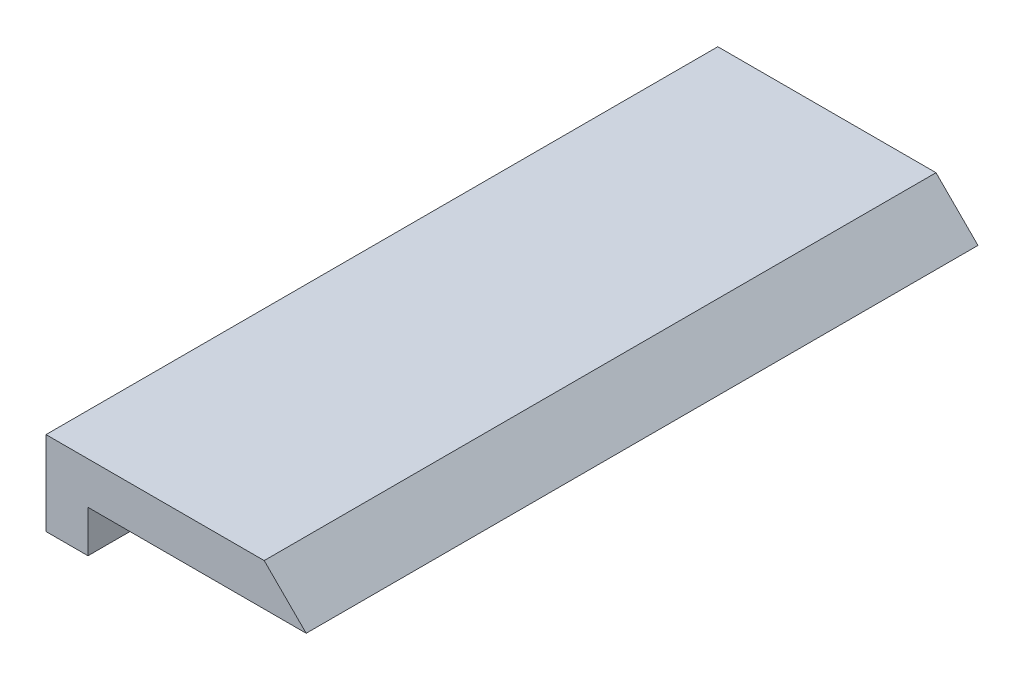
ISO-10303-21;
HEADER;
FILE_DESCRIPTION(('STEP AP214'),'2;1');
FILE_NAME('part.step','',(''),(''),'','','');
FILE_SCHEMA(('AUTOMOTIVE_DESIGN { 1 0 10303 214 1 1 1 1 }'));
ENDSEC;
DATA;
#1=APPLICATION_CONTEXT('core data for automotive mechanical design processes');
#2=APPLICATION_PROTOCOL_DEFINITION('international standard','automotive_design',2000,#1);
#3=PRODUCT_CONTEXT('',#1,'mechanical');
#4=PRODUCT('Part','Part','',(#3));
#5=PRODUCT_RELATED_PRODUCT_CATEGORY('part','',(#4));
#6=PRODUCT_DEFINITION_FORMATION('','',#4);
#7=PRODUCT_DEFINITION_CONTEXT('part definition',#1,'design');
#8=PRODUCT_DEFINITION('design','',#6,#7);
#9=PRODUCT_DEFINITION_SHAPE('','',#8);
#10=(LENGTH_UNIT() NAMED_UNIT(*) SI_UNIT(.MILLI.,.METRE.));
#11=(NAMED_UNIT(*) PLANE_ANGLE_UNIT() SI_UNIT($,.RADIAN.));
#12=(NAMED_UNIT(*) SI_UNIT($,.STERADIAN.) SOLID_ANGLE_UNIT());
#13=UNCERTAINTY_MEASURE_WITH_UNIT(LENGTH_MEASURE(1.E-05),#10,'distance_accuracy_value','');
#14=(GEOMETRIC_REPRESENTATION_CONTEXT(3) GLOBAL_UNCERTAINTY_ASSIGNED_CONTEXT((#13)) GLOBAL_UNIT_ASSIGNED_CONTEXT((#10,
#11,#12)) REPRESENTATION_CONTEXT('',''));
#15=CARTESIAN_POINT('',(0.,0.,0.));
#16=DIRECTION('',(0.,0.,1.));
#17=DIRECTION('',(1.,0.,0.));
#18=AXIS2_PLACEMENT_3D('',#15,#16,#17);
#19=CARTESIAN_POINT('',(33.,0.,50.8));
#20=DIRECTION('',(0.,1.,0.));
#21=DIRECTION('',(0.,0.,1.));
#22=AXIS2_PLACEMENT_3D('',#19,#20,#21);
#23=PLANE('',#22);
#24=DIRECTION('',(1.,0.,0.));
#25=VECTOR('',#24,1.);
#26=CARTESIAN_POINT('',(33.,0.,-50.8));
#27=LINE('',#26,#25);
#28=CARTESIAN_POINT('',(0.,0.,-50.8));
#29=VERTEX_POINT('',#28);
#30=CARTESIAN_POINT('',(33.,0.,-50.8));
#31=VERTEX_POINT('',#30);
#32=EDGE_CURVE('E121',#29,#31,#27,.T.);
#33=ORIENTED_EDGE('',*,*,#32,.T.);
#34=DIRECTION('',(0.,0.,-1.));
#35=VECTOR('',#34,1.);
#36=CARTESIAN_POINT('',(33.,0.,50.8));
#37=LINE('',#36,#35);
#38=CARTESIAN_POINT('',(33.,0.,50.8));
#39=VERTEX_POINT('',#38);
#40=EDGE_CURVE('E11',#39,#31,#37,.T.);
#41=ORIENTED_EDGE('',*,*,#40,.F.);
#42=DIRECTION('',(1.,0.,0.));
#43=VECTOR('',#42,1.);
#44=CARTESIAN_POINT('',(33.,0.,50.8));
#45=LINE('',#44,#43);
#46=CARTESIAN_POINT('',(0.,0.,50.8));
#47=VERTEX_POINT('',#46);
#48=EDGE_CURVE('E131',#47,#39,#45,.T.);
#49=ORIENTED_EDGE('',*,*,#48,.F.);
#50=DIRECTION('',(0.,0.,-1.));
#51=VECTOR('',#50,1.);
#52=CARTESIAN_POINT('',(0.,0.,50.8));
#53=LINE('',#52,#51);
#54=EDGE_CURVE('E117',#47,#29,#53,.T.);
#55=ORIENTED_EDGE('',*,*,#54,.T.);
#56=EDGE_LOOP('',(#33,#41,#49,#55));
#57=FACE_BOUND('',#56,.T.);
#58=ADVANCED_FACE('F37',(#57),#23,.F.);
#59=CARTESIAN_POINT('',(33.,0.,50.8));
#60=DIRECTION('',(-0.707106781186549,-0.707106781186546,0.));
#61=DIRECTION('',(0.707106781186546,-0.707106781186549,0.));
#62=AXIS2_PLACEMENT_3D('',#59,#60,#61);
#63=PLANE('',#62);
#64=DIRECTION('',(-0.707106781186546,0.707106781186549,0.));
#65=VECTOR('',#64,1.);
#66=CARTESIAN_POINT('',(33.,0.,-50.8));
#67=LINE('',#66,#65);
#68=CARTESIAN_POINT('',(26.65,6.35,-50.8));
#69=VERTEX_POINT('',#68);
#70=EDGE_CURVE('E124',#31,#69,#67,.T.);
#71=ORIENTED_EDGE('',*,*,#70,.T.);
#72=DIRECTION('',(0.,0.,-1.));
#73=VECTOR('',#72,1.);
#74=CARTESIAN_POINT('',(26.65,6.35,50.8));
#75=LINE('',#74,#73);
#76=CARTESIAN_POINT('',(26.65,6.35,50.8));
#77=VERTEX_POINT('',#76);
#78=EDGE_CURVE('E45',#77,#69,#75,.T.);
#79=ORIENTED_EDGE('',*,*,#78,.F.);
#80=DIRECTION('',(-0.707106781186546,0.707106781186549,0.));
#81=VECTOR('',#80,1.);
#82=CARTESIAN_POINT('',(33.,0.,50.8));
#83=LINE('',#82,#81);
#84=EDGE_CURVE('E90',#39,#77,#83,.T.);
#85=ORIENTED_EDGE('',*,*,#84,.F.);
#86=ORIENTED_EDGE('',*,*,#40,.T.);
#87=EDGE_LOOP('',(#71,#79,#85,#86));
#88=FACE_BOUND('',#87,.T.);
#89=ADVANCED_FACE('F155',(#88),#63,.F.);
#90=CARTESIAN_POINT('',(26.65,6.35,50.8));
#91=DIRECTION('',(0.,-1.,0.));
#92=DIRECTION('',(1.,0.,0.));
#93=AXIS2_PLACEMENT_3D('',#90,#91,#92);
#94=PLANE('',#93);
#95=DIRECTION('',(-1.,0.,0.));
#96=VECTOR('',#95,1.);
#97=CARTESIAN_POINT('',(26.65,6.35,-50.8));
#98=LINE('',#97,#96);
#99=CARTESIAN_POINT('',(-6.34999999999999,6.34999999999998,-50.8));
#100=VERTEX_POINT('',#99);
#101=EDGE_CURVE('E126',#69,#100,#98,.T.);
#102=ORIENTED_EDGE('',*,*,#101,.T.);
#103=DIRECTION('',(0.,0.,-1.));
#104=VECTOR('',#103,1.);
#105=CARTESIAN_POINT('',(-6.34999999999999,6.34999999999998,50.8));
#106=LINE('',#105,#104);
#107=CARTESIAN_POINT('',(-6.34999999999999,6.34999999999998,50.8));
#108=VERTEX_POINT('',#107);
#109=EDGE_CURVE('E112',#108,#100,#106,.T.);
#110=ORIENTED_EDGE('',*,*,#109,.F.);
#111=DIRECTION('',(-1.,0.,0.));
#112=VECTOR('',#111,1.);
#113=CARTESIAN_POINT('',(26.65,6.35,50.8));
#114=LINE('',#113,#112);
#115=EDGE_CURVE('E103',#77,#108,#114,.T.);
#116=ORIENTED_EDGE('',*,*,#115,.F.);
#117=ORIENTED_EDGE('',*,*,#78,.T.);
#118=EDGE_LOOP('',(#102,#110,#116,#117));
#119=FACE_BOUND('',#118,.T.);
#120=ADVANCED_FACE('F137',(#119),#94,.F.);
#121=CARTESIAN_POINT('',(-6.34999999999999,-6.35,50.8));
#122=DIRECTION('',(1.,0.,0.));
#123=DIRECTION('',(0.,0.,-1.));
#124=AXIS2_PLACEMENT_3D('',#121,#122,#123);
#125=PLANE('',#124);
#126=DIRECTION('',(0.,-1.,0.));
#127=VECTOR('',#126,1.);
#128=CARTESIAN_POINT('',(-6.34999999999999,-6.35,-50.8));
#129=LINE('',#128,#127);
#130=CARTESIAN_POINT('',(-6.34999999999999,-6.35,-50.8));
#131=VERTEX_POINT('',#130);
#132=EDGE_CURVE('E111',#100,#131,#129,.T.);
#133=ORIENTED_EDGE('',*,*,#132,.T.);
#134=DIRECTION('',(0.,0.,-1.));
#135=VECTOR('',#134,1.);
#136=CARTESIAN_POINT('',(-6.34999999999999,-6.35,50.8));
#137=LINE('',#136,#135);
#138=CARTESIAN_POINT('',(-6.34999999999999,-6.35,50.8));
#139=VERTEX_POINT('',#138);
#140=EDGE_CURVE('E108',#139,#131,#137,.T.);
#141=ORIENTED_EDGE('',*,*,#140,.F.);
#142=DIRECTION('',(0.,-1.,0.));
#143=VECTOR('',#142,1.);
#144=CARTESIAN_POINT('',(-6.34999999999999,-6.35,50.8));
#145=LINE('',#144,#143);
#146=EDGE_CURVE('E97',#108,#139,#145,.T.);
#147=ORIENTED_EDGE('',*,*,#146,.F.);
#148=ORIENTED_EDGE('',*,*,#109,.T.);
#149=EDGE_LOOP('',(#133,#141,#147,#148));
#150=FACE_BOUND('',#149,.T.);
#151=ADVANCED_FACE('F109',(#150),#125,.F.);
#152=CARTESIAN_POINT('',(0.,-6.35,50.8));
#153=DIRECTION('',(0.,1.,0.));
#154=DIRECTION('',(0.,0.,1.));
#155=AXIS2_PLACEMENT_3D('',#152,#153,#154);
#156=PLANE('',#155);
#157=DIRECTION('',(1.,0.,0.));
#158=VECTOR('',#157,1.);
#159=CARTESIAN_POINT('',(0.,-6.35,-50.8));
#160=LINE('',#159,#158);
#161=CARTESIAN_POINT('',(0.,-6.35,-50.8));
#162=VERTEX_POINT('',#161);
#163=EDGE_CURVE('E76',#131,#162,#160,.T.);
#164=ORIENTED_EDGE('',*,*,#163,.T.);
#165=DIRECTION('',(0.,0.,-1.));
#166=VECTOR('',#165,1.);
#167=CARTESIAN_POINT('',(0.,-6.35,50.8));
#168=LINE('',#167,#166);
#169=CARTESIAN_POINT('',(0.,-6.35,50.8));
#170=VERTEX_POINT('',#169);
#171=EDGE_CURVE('E113',#170,#162,#168,.T.);
#172=ORIENTED_EDGE('',*,*,#171,.F.);
#173=DIRECTION('',(1.,0.,0.));
#174=VECTOR('',#173,1.);
#175=CARTESIAN_POINT('',(0.,-6.35,50.8));
#176=LINE('',#175,#174);
#177=EDGE_CURVE('E101',#139,#170,#176,.T.);
#178=ORIENTED_EDGE('',*,*,#177,.F.);
#179=ORIENTED_EDGE('',*,*,#140,.T.);
#180=EDGE_LOOP('',(#164,#172,#178,#179));
#181=FACE_BOUND('',#180,.T.);
#182=ADVANCED_FACE('F115',(#181),#156,.F.);
#183=CARTESIAN_POINT('',(0.,0.,50.8));
#184=DIRECTION('',(-1.,0.,0.));
#185=DIRECTION('',(0.,-1.,0.));
#186=AXIS2_PLACEMENT_3D('',#183,#184,#185);
#187=PLANE('',#186);
#188=DIRECTION('',(0.,1.,0.));
#189=VECTOR('',#188,1.);
#190=CARTESIAN_POINT('',(0.,0.,-50.8));
#191=LINE('',#190,#189);
#192=EDGE_CURVE('E82',#162,#29,#191,.T.);
#193=ORIENTED_EDGE('',*,*,#192,.T.);
#194=ORIENTED_EDGE('',*,*,#54,.F.);
#195=DIRECTION('',(0.,1.,0.));
#196=VECTOR('',#195,1.);
#197=CARTESIAN_POINT('',(0.,0.,50.8));
#198=LINE('',#197,#196);
#199=EDGE_CURVE('E53',#170,#47,#198,.T.);
#200=ORIENTED_EDGE('',*,*,#199,.F.);
#201=ORIENTED_EDGE('',*,*,#171,.T.);
#202=EDGE_LOOP('',(#193,#194,#200,#201));
#203=FACE_BOUND('',#202,.T.);
#204=ADVANCED_FACE('F144',(#203),#187,.F.);
#205=CARTESIAN_POINT('',(0.,0.,50.8));
#206=DIRECTION('',(0.,0.,1.));
#207=DIRECTION('',(1.,0.,0.));
#208=AXIS2_PLACEMENT_3D('',#205,#206,#207);
#209=PLANE('',#208);
#210=ORIENTED_EDGE('',*,*,#48,.T.);
#211=ORIENTED_EDGE('',*,*,#84,.T.);
#212=ORIENTED_EDGE('',*,*,#115,.T.);
#213=ORIENTED_EDGE('',*,*,#146,.T.);
#214=ORIENTED_EDGE('',*,*,#177,.T.);
#215=ORIENTED_EDGE('',*,*,#199,.T.);
#216=EDGE_LOOP('',(#210,#211,#212,#213,#214,#215));
#217=FACE_BOUND('',#216,.T.);
#218=ADVANCED_FACE('F99',(#217),#209,.T.);
#219=CARTESIAN_POINT('',(0.,0.,-50.8));
#220=DIRECTION('',(0.,0.,1.));
#221=DIRECTION('',(1.,0.,0.));
#222=AXIS2_PLACEMENT_3D('',#219,#220,#221);
#223=PLANE('',#222);
#224=ORIENTED_EDGE('',*,*,#32,.F.);
#225=ORIENTED_EDGE('',*,*,#192,.F.);
#226=ORIENTED_EDGE('',*,*,#163,.F.);
#227=ORIENTED_EDGE('',*,*,#132,.F.);
#228=ORIENTED_EDGE('',*,*,#101,.F.);
#229=ORIENTED_EDGE('',*,*,#70,.F.);
#230=EDGE_LOOP('',(#224,#225,#226,#227,#228,#229));
#231=FACE_BOUND('',#230,.T.);
#232=ADVANCED_FACE('F140',(#231),#223,.F.);
#233=CLOSED_SHELL('',(#58,#89,#120,#151,#182,#204,#218,#232));
#234=MANIFOLD_SOLID_BREP('B2',#233);
#235=ADVANCED_BREP_SHAPE_REPRESENTATION('',(#18,#234),#14);
#236=SHAPE_DEFINITION_REPRESENTATION(#9,#235);
ENDSEC;
END-ISO-10303-21;
